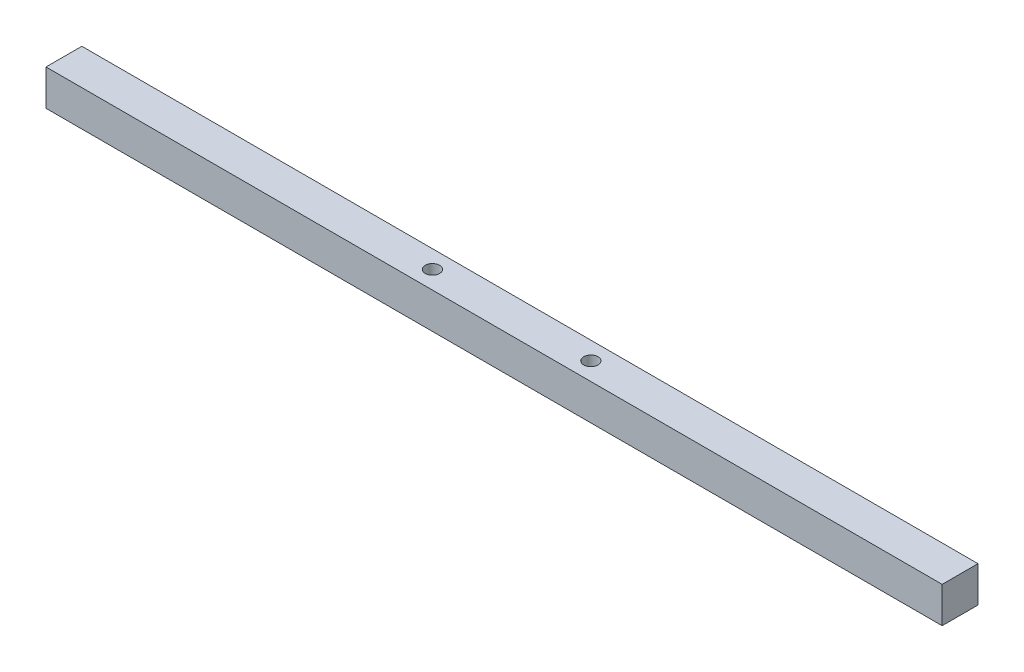
ISO-10303-21;
HEADER;
FILE_DESCRIPTION(('STEP AP214'),'2;1');
FILE_NAME('part.step','',(''),(''),'','','');
FILE_SCHEMA(('AUTOMOTIVE_DESIGN { 1 0 10303 214 1 1 1 1 }'));
ENDSEC;
DATA;
#1=APPLICATION_CONTEXT('core data for automotive mechanical design processes');
#2=APPLICATION_PROTOCOL_DEFINITION('international standard','automotive_design',2000,#1);
#3=PRODUCT_CONTEXT('',#1,'mechanical');
#4=PRODUCT('Part','Part','',(#3));
#5=PRODUCT_RELATED_PRODUCT_CATEGORY('part','',(#4));
#6=PRODUCT_DEFINITION_FORMATION('','',#4);
#7=PRODUCT_DEFINITION_CONTEXT('part definition',#1,'design');
#8=PRODUCT_DEFINITION('design','',#6,#7);
#9=PRODUCT_DEFINITION_SHAPE('','',#8);
#10=(LENGTH_UNIT() NAMED_UNIT(*) SI_UNIT(.MILLI.,.METRE.));
#11=(NAMED_UNIT(*) PLANE_ANGLE_UNIT() SI_UNIT($,.RADIAN.));
#12=(NAMED_UNIT(*) SI_UNIT($,.STERADIAN.) SOLID_ANGLE_UNIT());
#13=UNCERTAINTY_MEASURE_WITH_UNIT(LENGTH_MEASURE(1.E-05),#10,'distance_accuracy_value','');
#14=(GEOMETRIC_REPRESENTATION_CONTEXT(3) GLOBAL_UNCERTAINTY_ASSIGNED_CONTEXT((#13)) GLOBAL_UNIT_ASSIGNED_CONTEXT((#10,
#11,#12)) REPRESENTATION_CONTEXT('',''));
#15=CARTESIAN_POINT('',(0.,0.,0.));
#16=DIRECTION('',(0.,0.,1.));
#17=DIRECTION('',(1.,0.,0.));
#18=AXIS2_PLACEMENT_3D('',#15,#16,#17);
#19=CARTESIAN_POINT('',(500.,10.,-10.));
#20=DIRECTION('',(0.,0.,1.));
#21=DIRECTION('',(0.,-1.,0.));
#22=AXIS2_PLACEMENT_3D('',#19,#20,#21);
#23=PLANE('',#22);
#24=DIRECTION('',(0.,1.,0.));
#25=VECTOR('',#24,1.);
#26=CARTESIAN_POINT('',(0.,10.,-10.));
#27=LINE('',#26,#25);
#28=CARTESIAN_POINT('',(0.,-10.,-10.));
#29=VERTEX_POINT('',#28);
#30=CARTESIAN_POINT('',(0.,10.,-10.));
#31=VERTEX_POINT('',#30);
#32=EDGE_CURVE('E96',#29,#31,#27,.T.);
#33=ORIENTED_EDGE('',*,*,#32,.T.);
#34=DIRECTION('',(-1.,0.,0.));
#35=VECTOR('',#34,1.);
#36=CARTESIAN_POINT('',(500.,10.,-10.));
#37=LINE('',#36,#35);
#38=CARTESIAN_POINT('',(500.,10.,-10.));
#39=VERTEX_POINT('',#38);
#40=EDGE_CURVE('E11',#39,#31,#37,.T.);
#41=ORIENTED_EDGE('',*,*,#40,.F.);
#42=DIRECTION('',(0.,1.,0.));
#43=VECTOR('',#42,1.);
#44=CARTESIAN_POINT('',(500.,10.,-10.));
#45=LINE('',#44,#43);
#46=CARTESIAN_POINT('',(500.,-10.,-10.));
#47=VERTEX_POINT('',#46);
#48=EDGE_CURVE('E84',#47,#39,#45,.T.);
#49=ORIENTED_EDGE('',*,*,#48,.F.);
#50=DIRECTION('',(-1.,0.,0.));
#51=VECTOR('',#50,1.);
#52=CARTESIAN_POINT('',(500.,-10.,-10.));
#53=LINE('',#52,#51);
#54=EDGE_CURVE('E92',#47,#29,#53,.T.);
#55=ORIENTED_EDGE('',*,*,#54,.T.);
#56=EDGE_LOOP('',(#33,#41,#49,#55));
#57=FACE_BOUND('',#56,.T.);
#58=ADVANCED_FACE('F33',(#57),#23,.F.);
#59=CARTESIAN_POINT('',(500.,10.,10.));
#60=DIRECTION('',(0.,-1.,0.));
#61=DIRECTION('',(0.,0.,-1.));
#62=AXIS2_PLACEMENT_3D('',#59,#60,#61);
#63=PLANE('',#62);
#64=CARTESIAN_POINT('',(205.61,10.,0.));
#65=DIRECTION('',(0.,1.,0.));
#66=DIRECTION('',(0.,0.,1.));
#67=AXIS2_PLACEMENT_3D('',#64,#65,#66);
#68=CIRCLE('',#67,3.99999999999999);
#69=CARTESIAN_POINT('',(205.61,10.,3.99999999999999));
#70=VERTEX_POINT('',#69);
#71=EDGE_CURVE('E116',#70,#70,#68,.T.);
#72=ORIENTED_EDGE('',*,*,#71,.F.);
#73=EDGE_LOOP('',(#72));
#74=FACE_BOUND('',#73,.T.);
#75=CARTESIAN_POINT('',(294.,10.,0.));
#76=DIRECTION('',(0.,1.,0.));
#77=DIRECTION('',(0.,0.,1.));
#78=AXIS2_PLACEMENT_3D('',#75,#76,#77);
#79=CIRCLE('',#78,3.99999999999999);
#80=CARTESIAN_POINT('',(294.,10.,3.99999999999999));
#81=VERTEX_POINT('',#80);
#82=EDGE_CURVE('E110',#81,#81,#79,.T.);
#83=ORIENTED_EDGE('',*,*,#82,.F.);
#84=EDGE_LOOP('',(#83));
#85=FACE_BOUND('',#84,.T.);
#86=DIRECTION('',(0.,0.,1.));
#87=VECTOR('',#86,1.);
#88=CARTESIAN_POINT('',(0.,10.,10.));
#89=LINE('',#88,#87);
#90=CARTESIAN_POINT('',(0.,10.,10.));
#91=VERTEX_POINT('',#90);
#92=EDGE_CURVE('E88',#31,#91,#89,.T.);
#93=ORIENTED_EDGE('',*,*,#92,.T.);
#94=DIRECTION('',(-1.,0.,0.));
#95=VECTOR('',#94,1.);
#96=CARTESIAN_POINT('',(500.,10.,10.));
#97=LINE('',#96,#95);
#98=CARTESIAN_POINT('',(500.,10.,10.));
#99=VERTEX_POINT('',#98);
#100=EDGE_CURVE('E41',#99,#91,#97,.T.);
#101=ORIENTED_EDGE('',*,*,#100,.F.);
#102=DIRECTION('',(0.,0.,1.));
#103=VECTOR('',#102,1.);
#104=CARTESIAN_POINT('',(500.,10.,10.));
#105=LINE('',#104,#103);
#106=EDGE_CURVE('E79',#39,#99,#105,.T.);
#107=ORIENTED_EDGE('',*,*,#106,.F.);
#108=ORIENTED_EDGE('',*,*,#40,.T.);
#109=EDGE_LOOP('',(#93,#101,#107,#108));
#110=FACE_BOUND('',#109,.T.);
#111=ADVANCED_FACE('F87',(#74,#85,#110),#63,.F.);
#112=CARTESIAN_POINT('',(500.,10.,10.));
#113=DIRECTION('',(0.,0.,-1.));
#114=DIRECTION('',(0.,1.,0.));
#115=AXIS2_PLACEMENT_3D('',#112,#113,#114);
#116=PLANE('',#115);
#117=DIRECTION('',(0.,-1.,0.));
#118=VECTOR('',#117,1.);
#119=CARTESIAN_POINT('',(0.,10.,10.));
#120=LINE('',#119,#118);
#121=CARTESIAN_POINT('',(0.,-10.,10.));
#122=VERTEX_POINT('',#121);
#123=EDGE_CURVE('E66',#91,#122,#120,.T.);
#124=ORIENTED_EDGE('',*,*,#123,.T.);
#125=DIRECTION('',(-1.,0.,0.));
#126=VECTOR('',#125,1.);
#127=CARTESIAN_POINT('',(500.,-10.,10.));
#128=LINE('',#127,#126);
#129=CARTESIAN_POINT('',(500.,-10.,10.));
#130=VERTEX_POINT('',#129);
#131=EDGE_CURVE('E89',#130,#122,#128,.T.);
#132=ORIENTED_EDGE('',*,*,#131,.F.);
#133=DIRECTION('',(0.,-1.,0.));
#134=VECTOR('',#133,1.);
#135=CARTESIAN_POINT('',(500.,10.,10.));
#136=LINE('',#135,#134);
#137=EDGE_CURVE('E82',#99,#130,#136,.T.);
#138=ORIENTED_EDGE('',*,*,#137,.F.);
#139=ORIENTED_EDGE('',*,*,#100,.T.);
#140=EDGE_LOOP('',(#124,#132,#138,#139));
#141=FACE_BOUND('',#140,.T.);
#142=ADVANCED_FACE('F90',(#141),#116,.F.);
#143=CARTESIAN_POINT('',(500.,-10.,10.));
#144=DIRECTION('',(0.,1.,0.));
#145=DIRECTION('',(0.,0.,1.));
#146=AXIS2_PLACEMENT_3D('',#143,#144,#145);
#147=PLANE('',#146);
#148=CARTESIAN_POINT('',(205.61,-10.,0.));
#149=DIRECTION('',(0.,1.,0.));
#150=DIRECTION('',(0.,0.,1.));
#151=AXIS2_PLACEMENT_3D('',#148,#149,#150);
#152=CIRCLE('',#151,3.99999999999999);
#153=CARTESIAN_POINT('',(205.61,-10.,3.99999999999999));
#154=VERTEX_POINT('',#153);
#155=EDGE_CURVE('E99',#154,#154,#152,.T.);
#156=ORIENTED_EDGE('',*,*,#155,.T.);
#157=EDGE_LOOP('',(#156));
#158=FACE_BOUND('',#157,.T.);
#159=CARTESIAN_POINT('',(294.,-10.,0.));
#160=DIRECTION('',(0.,1.,0.));
#161=DIRECTION('',(0.,0.,1.));
#162=AXIS2_PLACEMENT_3D('',#159,#160,#161);
#163=CIRCLE('',#162,3.99999999999999);
#164=CARTESIAN_POINT('',(294.,-10.,3.99999999999999));
#165=VERTEX_POINT('',#164);
#166=EDGE_CURVE('E113',#165,#165,#163,.T.);
#167=ORIENTED_EDGE('',*,*,#166,.T.);
#168=EDGE_LOOP('',(#167));
#169=FACE_BOUND('',#168,.T.);
#170=DIRECTION('',(0.,0.,-1.));
#171=VECTOR('',#170,1.);
#172=CARTESIAN_POINT('',(0.,-10.,10.));
#173=LINE('',#172,#171);
#174=EDGE_CURVE('E72',#122,#29,#173,.T.);
#175=ORIENTED_EDGE('',*,*,#174,.T.);
#176=ORIENTED_EDGE('',*,*,#54,.F.);
#177=DIRECTION('',(0.,0.,-1.));
#178=VECTOR('',#177,1.);
#179=CARTESIAN_POINT('',(500.,-10.,10.));
#180=LINE('',#179,#178);
#181=EDGE_CURVE('E49',#130,#47,#180,.T.);
#182=ORIENTED_EDGE('',*,*,#181,.F.);
#183=ORIENTED_EDGE('',*,*,#131,.T.);
#184=EDGE_LOOP('',(#175,#176,#182,#183));
#185=FACE_BOUND('',#184,.T.);
#186=ADVANCED_FACE('F104',(#158,#169,#185),#147,.F.);
#187=CARTESIAN_POINT('',(500.,0.,0.));
#188=DIRECTION('',(1.,0.,0.));
#189=DIRECTION('',(0.,0.,-1.));
#190=AXIS2_PLACEMENT_3D('',#187,#188,#189);
#191=PLANE('',#190);
#192=ORIENTED_EDGE('',*,*,#48,.T.);
#193=ORIENTED_EDGE('',*,*,#106,.T.);
#194=ORIENTED_EDGE('',*,*,#137,.T.);
#195=ORIENTED_EDGE('',*,*,#181,.T.);
#196=EDGE_LOOP('',(#192,#193,#194,#195));
#197=FACE_BOUND('',#196,.T.);
#198=ADVANCED_FACE('F80',(#197),#191,.T.);
#199=CARTESIAN_POINT('',(0.,0.,0.));
#200=DIRECTION('',(1.,0.,0.));
#201=DIRECTION('',(0.,0.,-1.));
#202=AXIS2_PLACEMENT_3D('',#199,#200,#201);
#203=PLANE('',#202);
#204=ORIENTED_EDGE('',*,*,#32,.F.);
#205=ORIENTED_EDGE('',*,*,#174,.F.);
#206=ORIENTED_EDGE('',*,*,#123,.F.);
#207=ORIENTED_EDGE('',*,*,#92,.F.);
#208=EDGE_LOOP('',(#204,#205,#206,#207));
#209=FACE_BOUND('',#208,.T.);
#210=ADVANCED_FACE('F107',(#209),#203,.F.);
#211=CARTESIAN_POINT('',(294.,-10.,0.));
#212=DIRECTION('',(0.,1.,0.));
#213=DIRECTION('',(0.,0.,1.));
#214=AXIS2_PLACEMENT_3D('',#211,#212,#213);
#215=CYLINDRICAL_SURFACE('',#214,3.99999999999999);
#216=ORIENTED_EDGE('',*,*,#166,.F.);
#217=EDGE_LOOP('',(#216));
#218=FACE_BOUND('',#217,.T.);
#219=ORIENTED_EDGE('',*,*,#82,.T.);
#220=EDGE_LOOP('',(#219));
#221=FACE_BOUND('',#220,.T.);
#222=ADVANCED_FACE('F127',(#218,#221),#215,.F.);
#223=CARTESIAN_POINT('',(205.61,-10.,0.));
#224=DIRECTION('',(0.,1.,0.));
#225=DIRECTION('',(0.,0.,1.));
#226=AXIS2_PLACEMENT_3D('',#223,#224,#225);
#227=CYLINDRICAL_SURFACE('',#226,3.99999999999999);
#228=ORIENTED_EDGE('',*,*,#155,.F.);
#229=EDGE_LOOP('',(#228));
#230=FACE_BOUND('',#229,.T.);
#231=ORIENTED_EDGE('',*,*,#71,.T.);
#232=EDGE_LOOP('',(#231));
#233=FACE_BOUND('',#232,.T.);
#234=ADVANCED_FACE('F124',(#230,#233),#227,.F.);
#235=CLOSED_SHELL('',(#58,#111,#142,#186,#198,#210,#222,#234));
#236=MANIFOLD_SOLID_BREP('B2',#235);
#237=ADVANCED_BREP_SHAPE_REPRESENTATION('',(#18,#236),#14);
#238=SHAPE_DEFINITION_REPRESENTATION(#9,#237);
ENDSEC;
END-ISO-10303-21;
